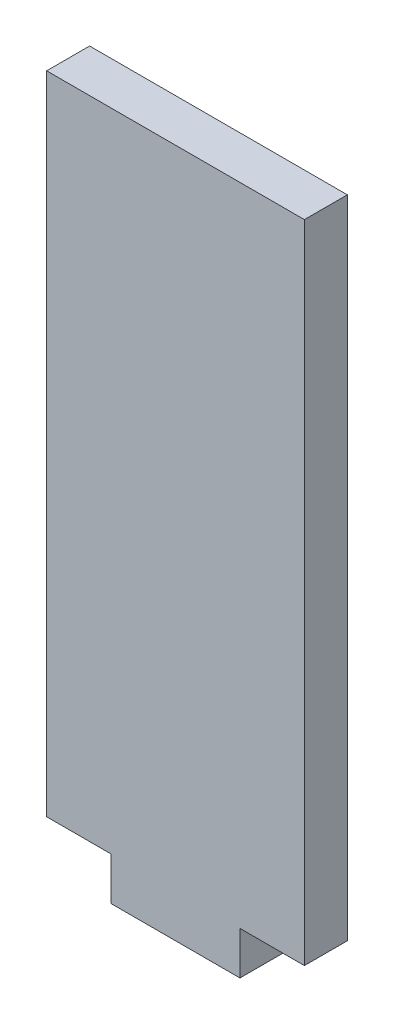
ISO-10303-21;
HEADER;
FILE_DESCRIPTION(('STEP AP214'),'2;1');
FILE_NAME('part.step','',(''),(''),'','','');
FILE_SCHEMA(('AUTOMOTIVE_DESIGN { 1 0 10303 214 1 1 1 1 }'));
ENDSEC;
DATA;
#1=APPLICATION_CONTEXT('core data for automotive mechanical design processes');
#2=APPLICATION_PROTOCOL_DEFINITION('international standard','automotive_design',2000,#1);
#3=PRODUCT_CONTEXT('',#1,'mechanical');
#4=PRODUCT('Part','Part','',(#3));
#5=PRODUCT_RELATED_PRODUCT_CATEGORY('part','',(#4));
#6=PRODUCT_DEFINITION_FORMATION('','',#4);
#7=PRODUCT_DEFINITION_CONTEXT('part definition',#1,'design');
#8=PRODUCT_DEFINITION('design','',#6,#7);
#9=PRODUCT_DEFINITION_SHAPE('','',#8);
#10=(LENGTH_UNIT() NAMED_UNIT(*) SI_UNIT(.MILLI.,.METRE.));
#11=(NAMED_UNIT(*) PLANE_ANGLE_UNIT() SI_UNIT($,.RADIAN.));
#12=(NAMED_UNIT(*) SI_UNIT($,.STERADIAN.) SOLID_ANGLE_UNIT());
#13=UNCERTAINTY_MEASURE_WITH_UNIT(LENGTH_MEASURE(1.E-05),#10,'distance_accuracy_value','');
#14=(GEOMETRIC_REPRESENTATION_CONTEXT(3) GLOBAL_UNCERTAINTY_ASSIGNED_CONTEXT((#13)) GLOBAL_UNIT_ASSIGNED_CONTEXT((#10,
#11,#12)) REPRESENTATION_CONTEXT('',''));
#15=CARTESIAN_POINT('',(0.,0.,0.));
#16=DIRECTION('',(0.,0.,1.));
#17=DIRECTION('',(1.,0.,0.));
#18=AXIS2_PLACEMENT_3D('',#15,#16,#17);
#19=CARTESIAN_POINT('',(-6.,0.,2.));
#20=DIRECTION('',(-1.,0.,0.));
#21=DIRECTION('',(0.,0.,1.));
#22=AXIS2_PLACEMENT_3D('',#19,#20,#21);
#23=PLANE('',#22);
#24=DIRECTION('',(0.,1.,0.));
#25=VECTOR('',#24,1.);
#26=CARTESIAN_POINT('',(-6.,0.,0.));
#27=LINE('',#26,#25);
#28=CARTESIAN_POINT('',(-6.,0.,0.));
#29=VERTEX_POINT('',#28);
#30=CARTESIAN_POINT('',(-6.,30.0787744086171,0.));
#31=VERTEX_POINT('',#30);
#32=EDGE_CURVE('E150',#29,#31,#27,.T.);
#33=ORIENTED_EDGE('',*,*,#32,.F.);
#34=DIRECTION('',(0.,0.,-1.));
#35=VECTOR('',#34,1.);
#36=CARTESIAN_POINT('',(-6.,0.,2.));
#37=LINE('',#36,#35);
#38=CARTESIAN_POINT('',(-6.,0.,2.));
#39=VERTEX_POINT('',#38);
#40=EDGE_CURVE('E11',#39,#29,#37,.T.);
#41=ORIENTED_EDGE('',*,*,#40,.F.);
#42=DIRECTION('',(0.,1.,0.));
#43=VECTOR('',#42,1.);
#44=CARTESIAN_POINT('',(-6.,15.,2.));
#45=LINE('',#44,#43);
#46=CARTESIAN_POINT('',(-6.,30.0787744086171,2.));
#47=VERTEX_POINT('',#46);
#48=EDGE_CURVE('E55',#39,#47,#45,.T.);
#49=ORIENTED_EDGE('',*,*,#48,.T.);
#50=DIRECTION('',(0.,0.,-1.));
#51=VECTOR('',#50,1.);
#52=CARTESIAN_POINT('',(-6.,30.0787744086171,2.));
#53=LINE('',#52,#51);
#54=EDGE_CURVE('E40',#47,#31,#53,.T.);
#55=ORIENTED_EDGE('',*,*,#54,.T.);
#56=EDGE_LOOP('',(#33,#41,#49,#55));
#57=FACE_BOUND('',#56,.T.);
#58=ADVANCED_FACE('F36',(#57),#23,.T.);
#59=CARTESIAN_POINT('',(-6.,0.,2.));
#60=DIRECTION('',(0.,1.,0.));
#61=DIRECTION('',(-1.,0.,0.));
#62=AXIS2_PLACEMENT_3D('',#59,#60,#61);
#63=PLANE('',#62);
#64=DIRECTION('',(1.,0.,0.));
#65=VECTOR('',#64,1.);
#66=CARTESIAN_POINT('',(-6.,0.,0.));
#67=LINE('',#66,#65);
#68=CARTESIAN_POINT('',(-3.,0.,0.));
#69=VERTEX_POINT('',#68);
#70=EDGE_CURVE('E83',#29,#69,#67,.T.);
#71=ORIENTED_EDGE('',*,*,#70,.T.);
#72=DIRECTION('',(0.,0.,-1.));
#73=VECTOR('',#72,1.);
#74=CARTESIAN_POINT('',(-3.,0.,2.));
#75=LINE('',#74,#73);
#76=CARTESIAN_POINT('',(-3.,0.,2.));
#77=VERTEX_POINT('',#76);
#78=EDGE_CURVE('E46',#77,#69,#75,.T.);
#79=ORIENTED_EDGE('',*,*,#78,.F.);
#80=DIRECTION('',(1.,0.,0.));
#81=VECTOR('',#80,1.);
#82=CARTESIAN_POINT('',(-6.,0.,2.));
#83=LINE('',#82,#81);
#84=EDGE_CURVE('E114',#39,#77,#83,.T.);
#85=ORIENTED_EDGE('',*,*,#84,.F.);
#86=ORIENTED_EDGE('',*,*,#40,.T.);
#87=EDGE_LOOP('',(#71,#79,#85,#86));
#88=FACE_BOUND('',#87,.T.);
#89=ADVANCED_FACE('F189',(#88),#63,.F.);
#90=CARTESIAN_POINT('',(-3.,0.,2.));
#91=DIRECTION('',(1.,0.,0.));
#92=DIRECTION('',(0.,1.,0.));
#93=AXIS2_PLACEMENT_3D('',#90,#91,#92);
#94=PLANE('',#93);
#95=DIRECTION('',(0.,-1.,0.));
#96=VECTOR('',#95,1.);
#97=CARTESIAN_POINT('',(-3.,0.,0.));
#98=LINE('',#97,#96);
#99=CARTESIAN_POINT('',(-3.,-2.,0.));
#100=VERTEX_POINT('',#99);
#101=EDGE_CURVE('E121',#69,#100,#98,.T.);
#102=ORIENTED_EDGE('',*,*,#101,.T.);
#103=DIRECTION('',(0.,0.,-1.));
#104=VECTOR('',#103,1.);
#105=CARTESIAN_POINT('',(-3.,-2.,2.));
#106=LINE('',#105,#104);
#107=CARTESIAN_POINT('',(-3.,-2.,2.));
#108=VERTEX_POINT('',#107);
#109=EDGE_CURVE('E118',#108,#100,#106,.T.);
#110=ORIENTED_EDGE('',*,*,#109,.F.);
#111=DIRECTION('',(0.,-1.,0.));
#112=VECTOR('',#111,1.);
#113=CARTESIAN_POINT('',(-3.,0.,2.));
#114=LINE('',#113,#112);
#115=EDGE_CURVE('E107',#77,#108,#114,.T.);
#116=ORIENTED_EDGE('',*,*,#115,.F.);
#117=ORIENTED_EDGE('',*,*,#78,.T.);
#118=EDGE_LOOP('',(#102,#110,#116,#117));
#119=FACE_BOUND('',#118,.T.);
#120=ADVANCED_FACE('F119',(#119),#94,.F.);
#121=CARTESIAN_POINT('',(-3.,-2.,2.));
#122=DIRECTION('',(0.,1.,0.));
#123=DIRECTION('',(-1.,0.,0.));
#124=AXIS2_PLACEMENT_3D('',#121,#122,#123);
#125=PLANE('',#124);
#126=DIRECTION('',(1.,0.,0.));
#127=VECTOR('',#126,1.);
#128=CARTESIAN_POINT('',(-3.,-2.,0.));
#129=LINE('',#128,#127);
#130=CARTESIAN_POINT('',(3.,-2.,0.));
#131=VERTEX_POINT('',#130);
#132=EDGE_CURVE('E146',#100,#131,#129,.T.);
#133=ORIENTED_EDGE('',*,*,#132,.T.);
#134=DIRECTION('',(0.,0.,-1.));
#135=VECTOR('',#134,1.);
#136=CARTESIAN_POINT('',(3.,-2.,2.));
#137=LINE('',#136,#135);
#138=CARTESIAN_POINT('',(3.,-2.,2.));
#139=VERTEX_POINT('',#138);
#140=EDGE_CURVE('E125',#139,#131,#137,.T.);
#141=ORIENTED_EDGE('',*,*,#140,.F.);
#142=DIRECTION('',(1.,0.,0.));
#143=VECTOR('',#142,1.);
#144=CARTESIAN_POINT('',(-3.,-2.,2.));
#145=LINE('',#144,#143);
#146=EDGE_CURVE('E112',#108,#139,#145,.T.);
#147=ORIENTED_EDGE('',*,*,#146,.F.);
#148=ORIENTED_EDGE('',*,*,#109,.T.);
#149=EDGE_LOOP('',(#133,#141,#147,#148));
#150=FACE_BOUND('',#149,.T.);
#151=ADVANCED_FACE('F127',(#150),#125,.F.);
#152=CARTESIAN_POINT('',(3.,0.,2.));
#153=DIRECTION('',(1.,0.,0.));
#154=DIRECTION('',(0.,0.,-1.));
#155=AXIS2_PLACEMENT_3D('',#152,#153,#154);
#156=PLANE('',#155);
#157=DIRECTION('',(0.,-1.,0.));
#158=VECTOR('',#157,1.);
#159=CARTESIAN_POINT('',(3.,0.,0.));
#160=LINE('',#159,#158);
#161=CARTESIAN_POINT('',(3.,0.,0.));
#162=VERTEX_POINT('',#161);
#163=EDGE_CURVE('E143',#162,#131,#160,.T.);
#164=ORIENTED_EDGE('',*,*,#163,.F.);
#165=DIRECTION('',(0.,0.,-1.));
#166=VECTOR('',#165,1.);
#167=CARTESIAN_POINT('',(3.,0.,2.));
#168=LINE('',#167,#166);
#169=CARTESIAN_POINT('',(3.,0.,2.));
#170=VERTEX_POINT('',#169);
#171=EDGE_CURVE('E154',#170,#162,#168,.T.);
#172=ORIENTED_EDGE('',*,*,#171,.F.);
#173=DIRECTION('',(0.,-1.,0.));
#174=VECTOR('',#173,1.);
#175=CARTESIAN_POINT('',(3.,0.,2.));
#176=LINE('',#175,#174);
#177=EDGE_CURVE('E129',#170,#139,#176,.T.);
#178=ORIENTED_EDGE('',*,*,#177,.T.);
#179=ORIENTED_EDGE('',*,*,#140,.T.);
#180=EDGE_LOOP('',(#164,#172,#178,#179));
#181=FACE_BOUND('',#180,.T.);
#182=ADVANCED_FACE('F168',(#181),#156,.T.);
#183=CARTESIAN_POINT('',(3.,0.,2.));
#184=DIRECTION('',(0.,1.,0.));
#185=DIRECTION('',(-1.,0.,0.));
#186=AXIS2_PLACEMENT_3D('',#183,#184,#185);
#187=PLANE('',#186);
#188=DIRECTION('',(1.,0.,0.));
#189=VECTOR('',#188,1.);
#190=CARTESIAN_POINT('',(3.,0.,0.));
#191=LINE('',#190,#189);
#192=CARTESIAN_POINT('',(6.,0.,0.));
#193=VERTEX_POINT('',#192);
#194=EDGE_CURVE('E141',#162,#193,#191,.T.);
#195=ORIENTED_EDGE('',*,*,#194,.T.);
#196=DIRECTION('',(0.,0.,-1.));
#197=VECTOR('',#196,1.);
#198=CARTESIAN_POINT('',(6.,0.,2.));
#199=LINE('',#198,#197);
#200=CARTESIAN_POINT('',(6.,0.,2.));
#201=VERTEX_POINT('',#200);
#202=EDGE_CURVE('E156',#201,#193,#199,.T.);
#203=ORIENTED_EDGE('',*,*,#202,.F.);
#204=DIRECTION('',(1.,0.,0.));
#205=VECTOR('',#204,1.);
#206=CARTESIAN_POINT('',(3.,0.,2.));
#207=LINE('',#206,#205);
#208=EDGE_CURVE('E131',#170,#201,#207,.T.);
#209=ORIENTED_EDGE('',*,*,#208,.F.);
#210=ORIENTED_EDGE('',*,*,#171,.T.);
#211=EDGE_LOOP('',(#195,#203,#209,#210));
#212=FACE_BOUND('',#211,.T.);
#213=ADVANCED_FACE('F175',(#212),#187,.F.);
#214=CARTESIAN_POINT('',(6.,0.,2.));
#215=DIRECTION('',(-1.,0.,0.));
#216=DIRECTION('',(0.,0.,1.));
#217=AXIS2_PLACEMENT_3D('',#214,#215,#216);
#218=PLANE('',#217);
#219=DIRECTION('',(0.,1.,0.));
#220=VECTOR('',#219,1.);
#221=CARTESIAN_POINT('',(6.,0.,0.));
#222=LINE('',#221,#220);
#223=CARTESIAN_POINT('',(6.,30.0787744086171,0.));
#224=VERTEX_POINT('',#223);
#225=EDGE_CURVE('E139',#193,#224,#222,.T.);
#226=ORIENTED_EDGE('',*,*,#225,.T.);
#227=DIRECTION('',(0.,0.,-1.));
#228=VECTOR('',#227,1.);
#229=CARTESIAN_POINT('',(6.,30.0787744086171,2.));
#230=LINE('',#229,#228);
#231=CARTESIAN_POINT('',(6.,30.0787744086171,2.));
#232=VERTEX_POINT('',#231);
#233=EDGE_CURVE('E158',#232,#224,#230,.T.);
#234=ORIENTED_EDGE('',*,*,#233,.F.);
#235=DIRECTION('',(0.,-1.,0.));
#236=VECTOR('',#235,1.);
#237=CARTESIAN_POINT('',(6.,30.0787744086171,2.));
#238=LINE('',#237,#236);
#239=EDGE_CURVE('E173',#232,#201,#238,.T.);
#240=ORIENTED_EDGE('',*,*,#239,.T.);
#241=ORIENTED_EDGE('',*,*,#202,.T.);
#242=EDGE_LOOP('',(#226,#234,#240,#241));
#243=FACE_BOUND('',#242,.T.);
#244=ADVANCED_FACE('F177',(#243),#218,.F.);
#245=CARTESIAN_POINT('',(-6.,30.0787744086171,2.));
#246=DIRECTION('',(0.,1.,0.));
#247=DIRECTION('',(0.,0.,1.));
#248=AXIS2_PLACEMENT_3D('',#245,#246,#247);
#249=PLANE('',#248);
#250=DIRECTION('',(1.,0.,0.));
#251=VECTOR('',#250,1.);
#252=CARTESIAN_POINT('',(-6.,30.0787744086171,0.));
#253=LINE('',#252,#251);
#254=EDGE_CURVE('E136',#31,#224,#253,.T.);
#255=ORIENTED_EDGE('',*,*,#254,.F.);
#256=ORIENTED_EDGE('',*,*,#54,.F.);
#257=DIRECTION('',(1.,0.,0.));
#258=VECTOR('',#257,1.);
#259=CARTESIAN_POINT('',(-6.,30.0787744086171,2.));
#260=LINE('',#259,#258);
#261=EDGE_CURVE('E178',#47,#232,#260,.T.);
#262=ORIENTED_EDGE('',*,*,#261,.T.);
#263=ORIENTED_EDGE('',*,*,#233,.T.);
#264=EDGE_LOOP('',(#255,#256,#262,#263));
#265=FACE_BOUND('',#264,.T.);
#266=ADVANCED_FACE('F38',(#265),#249,.T.);
#267=CARTESIAN_POINT('',(0.,0.,2.));
#268=DIRECTION('',(0.,0.,-1.));
#269=DIRECTION('',(-1.,0.,0.));
#270=AXIS2_PLACEMENT_3D('',#267,#268,#269);
#271=PLANE('',#270);
#272=ORIENTED_EDGE('',*,*,#48,.F.);
#273=ORIENTED_EDGE('',*,*,#84,.T.);
#274=ORIENTED_EDGE('',*,*,#115,.T.);
#275=ORIENTED_EDGE('',*,*,#146,.T.);
#276=ORIENTED_EDGE('',*,*,#177,.F.);
#277=ORIENTED_EDGE('',*,*,#208,.T.);
#278=ORIENTED_EDGE('',*,*,#239,.F.);
#279=ORIENTED_EDGE('',*,*,#261,.F.);
#280=EDGE_LOOP('',(#272,#273,#274,#275,#276,#277,#278,#279));
#281=FACE_BOUND('',#280,.T.);
#282=ADVANCED_FACE('F109',(#281),#271,.F.);
#283=CARTESIAN_POINT('',(0.,0.,0.));
#284=DIRECTION('',(0.,0.,-1.));
#285=DIRECTION('',(-1.,0.,0.));
#286=AXIS2_PLACEMENT_3D('',#283,#284,#285);
#287=PLANE('',#286);
#288=ORIENTED_EDGE('',*,*,#32,.T.);
#289=ORIENTED_EDGE('',*,*,#254,.T.);
#290=ORIENTED_EDGE('',*,*,#225,.F.);
#291=ORIENTED_EDGE('',*,*,#194,.F.);
#292=ORIENTED_EDGE('',*,*,#163,.T.);
#293=ORIENTED_EDGE('',*,*,#132,.F.);
#294=ORIENTED_EDGE('',*,*,#101,.F.);
#295=ORIENTED_EDGE('',*,*,#70,.F.);
#296=EDGE_LOOP('',(#288,#289,#290,#291,#292,#293,#294,#295));
#297=FACE_BOUND('',#296,.T.);
#298=ADVANCED_FACE('F164',(#297),#287,.T.);
#299=CLOSED_SHELL('',(#58,#89,#120,#151,#182,#213,#244,#266,#282,#298));
#300=MANIFOLD_SOLID_BREP('B2',#299);
#301=ADVANCED_BREP_SHAPE_REPRESENTATION('',(#18,#300),#14);
#302=SHAPE_DEFINITION_REPRESENTATION(#9,#301);
ENDSEC;
END-ISO-10303-21;
